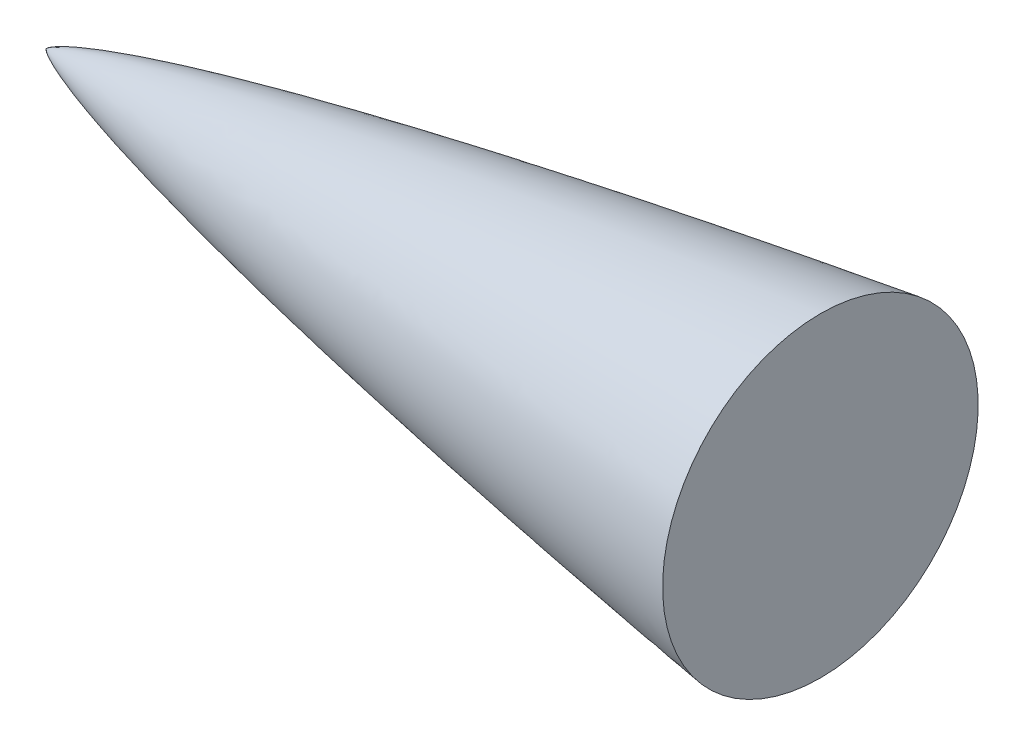
ISO-10303-21;
HEADER;
FILE_DESCRIPTION(('STEP AP214'),'2;1');
FILE_NAME('part.step','',(''),(''),'','','');
FILE_SCHEMA(('AUTOMOTIVE_DESIGN { 1 0 10303 214 1 1 1 1 }'));
ENDSEC;
DATA;
#1=APPLICATION_CONTEXT('core data for automotive mechanical design processes');
#2=APPLICATION_PROTOCOL_DEFINITION('international standard','automotive_design',2000,#1);
#3=PRODUCT_CONTEXT('',#1,'mechanical');
#4=PRODUCT('Part','Part','',(#3));
#5=PRODUCT_RELATED_PRODUCT_CATEGORY('part','',(#4));
#6=PRODUCT_DEFINITION_FORMATION('','',#4);
#7=PRODUCT_DEFINITION_CONTEXT('part definition',#1,'design');
#8=PRODUCT_DEFINITION('design','',#6,#7);
#9=PRODUCT_DEFINITION_SHAPE('','',#8);
#10=(LENGTH_UNIT() NAMED_UNIT(*) SI_UNIT(.MILLI.,.METRE.));
#11=(NAMED_UNIT(*) PLANE_ANGLE_UNIT() SI_UNIT($,.RADIAN.));
#12=(NAMED_UNIT(*) SI_UNIT($,.STERADIAN.) SOLID_ANGLE_UNIT());
#13=UNCERTAINTY_MEASURE_WITH_UNIT(LENGTH_MEASURE(1.E-05),#10,'distance_accuracy_value','');
#14=(GEOMETRIC_REPRESENTATION_CONTEXT(3) GLOBAL_UNCERTAINTY_ASSIGNED_CONTEXT((#13)) GLOBAL_UNIT_ASSIGNED_CONTEXT((#10,
#11,#12)) REPRESENTATION_CONTEXT('',''));
#15=CARTESIAN_POINT('',(0.,0.,0.));
#16=DIRECTION('',(0.,0.,1.));
#17=DIRECTION('',(1.,0.,0.));
#18=AXIS2_PLACEMENT_3D('',#15,#16,#17);
#19=CARTESIAN_POINT('',(762.,83.841254665666,0.));
#20=CARTESIAN_POINT('',(759.615436090338,83.8348786530274,0.));
#21=CARTESIAN_POINT('',(754.846503833814,83.7859260177921,0.));
#22=CARTESIAN_POINT('',(745.309411706468,83.6327608330306,0.));
#23=CARTESIAN_POINT('',(729.852911101212,83.2590075767634,0.));
#24=CARTESIAN_POINT('',(710.863439025648,82.6553562596267,0.));
#25=CARTESIAN_POINT('',(682.425589554388,81.5391979712966,0.));
#26=CARTESIAN_POINT('',(646.930327878799,79.8372948360595,0.));
#27=CARTESIAN_POINT('',(605.538293136767,77.4858004644496,0.));
#28=CARTESIAN_POINT('',(558.259527801623,74.3703783950666,0.));
#29=CARTESIAN_POINT('',(511.00790004468,70.8684145222591,0.));
#30=CARTESIAN_POINT('',(463.784734461524,67.0021255480557,0.));
#31=CARTESIAN_POINT('',(416.591925171861,62.781349506755,0.));
#32=CARTESIAN_POINT('',(369.432294543761,58.204857708494,0.));
#33=CARTESIAN_POINT('',(322.309575865078,53.2618983416283,0.));
#34=CARTESIAN_POINT('',(275.229416109303,47.9286839235141,0.));
#35=CARTESIAN_POINT('',(228.199436648054,42.167572329428,0.));
#36=CARTESIAN_POINT('',(181.232321927949,35.9138473948452,0.));
#37=CARTESIAN_POINT('',(134.347160824015,29.0668928368045,0.));
#38=CARTESIAN_POINT('',(92.5014071109869,22.2363785489674,0.));
#39=CARTESIAN_POINT('',(58.21468034422,15.8817272260005,0.));
#40=CARTESIAN_POINT('',(33.3857956173297,10.5208699171543,0.));
#41=CARTESIAN_POINT('',(18.9995170679273,6.91730383821913,0.));
#42=CARTESIAN_POINT('',(10.6680057521807,4.4902673249165,0.));
#43=CARTESIAN_POINT('',(6.15457812687039,2.96983830397565,0.));
#44=CARTESIAN_POINT('',(3.71093173791413,2.02979684979071,0.));
#45=CARTESIAN_POINT('',(2.33539055045532,1.4322686637271,0.));
#46=CARTESIAN_POINT('',(1.57274450360088,1.06289215559482,0.));
#47=CARTESIAN_POINT('',(1.12686422152927,0.826333920179848,0.));
#48=CARTESIAN_POINT('',(0.841412680935005,0.663024363572451,0.));
#49=CARTESIAN_POINT('',(0.646496772260084,0.544815951928162,0.));
#50=CARTESIAN_POINT('',(0.476816380111575,0.434147846193127,0.));
#51=CARTESIAN_POINT('',(0.332279693831272,0.331578395878514,0.));
#52=CARTESIAN_POINT('',(0.212062429273832,0.237272492825021,0.));
#53=CARTESIAN_POINT('',(0.127523873180296,0.16317614387605,0.));
#54=CARTESIAN_POINT('',(0.0656948489665144,0.100096678261966,0.));
#55=CARTESIAN_POINT('',(0.0254287850938619,0.0499114059335762,0.));
#56=CARTESIAN_POINT('',(0.00852037979638455,0.0225456416973723,0.));
#57=CARTESIAN_POINT('',(0.00246903573026898,0.00769815196811599,0.));
#58=CARTESIAN_POINT('',(0.,0.,0.));
#59=B_SPLINE_CURVE_WITH_KNOTS('',4,(#19,#20,#21,#22,#23,#24,#25,#26,#27,#28,#29,#30,#31,#32,#33,
#34,#35,#36,#37,#38,#39,#40,#41,#42,#43,#44,#45,#46,#47,#48,#49,#50,#51,#52,#53,#54,#55,#56,#57,
#58),.UNSPECIFIED.,.F.,.F.,(5,1,1,1,1,1,1,1,1,1,1,1,1,1,1,1,1,1,1,1,1,1,1,1,1,1,1,1,1,1,1,1,1,1,
1,1,5),(0.,0.0124161059668282,0.0248322119336565,0.049664423867313,0.0805025666095178,
0.111340709351723,0.173016994026944,0.234693278836645,0.296369564823901,0.358045848720771,
0.419722133463729,0.481398418876491,0.54307470462883,0.604750988677317,0.666427272970698,
0.728103557458164,0.789779842686226,0.851456126777999,0.913132399525486,0.948859992798878,
0.971324348437416,0.983696367274972,0.990338333588904,0.994032978251234,0.996115820711361,
0.997325305761031,0.998144918607654,0.998444153837526,0.998743389067397,0.99903753699717,
0.999331684926943,0.999498763695207,0.999665842463471,0.999832921231736,0.999916460615868,
0.999958230307934,1.),.UNSPECIFIED.);
#60=CARTESIAN_POINT('',(0.,0.,0.));
#61=DIRECTION('',(-1.,0.,0.));
#62=AXIS1_PLACEMENT('',#60,#61);
#63=SURFACE_OF_REVOLUTION('',#59,#62);
#64=CARTESIAN_POINT('',(0.,0.,0.));
#65=VERTEX_POINT('',#64);
#66=VERTEX_LOOP('',#65);
#67=FACE_BOUND('',#66,.T.);
#68=CARTESIAN_POINT('',(162.56,0.,0.));
#69=DIRECTION('',(-1.,0.,0.));
#70=DIRECTION('',(0.,-1.,0.));
#71=AXIS2_PLACEMENT_3D('',#68,#69,#70);
#72=CIRCLE('',#71,33.1280498009156);
#73=CARTESIAN_POINT('',(162.56,-33.1280498009156,0.));
#74=VERTEX_POINT('',#73);
#75=EDGE_CURVE('E11',#74,#74,#72,.F.);
#76=ORIENTED_EDGE('',*,*,#75,.F.);
#77=EDGE_LOOP('',(#76));
#78=FACE_BOUND('',#77,.T.);
#79=ADVANCED_FACE('F34',(#67,#78),#63,.T.);
#80=CARTESIAN_POINT('',(162.56,0.,0.));
#81=DIRECTION('',(1.,0.,0.));
#82=DIRECTION('',(0.,1.,0.));
#83=AXIS2_PLACEMENT_3D('',#80,#81,#82);
#84=PLANE('',#83);
#85=ORIENTED_EDGE('',*,*,#75,.T.);
#86=EDGE_LOOP('',(#85));
#87=FACE_BOUND('',#86,.T.);
#88=ADVANCED_FACE('F44',(#87),#84,.T.);
#89=CLOSED_SHELL('',(#79,#88));
#90=MANIFOLD_SOLID_BREP('B2',#89);
#91=ADVANCED_BREP_SHAPE_REPRESENTATION('',(#18,#90),#14);
#92=SHAPE_DEFINITION_REPRESENTATION(#9,#91);
ENDSEC;
END-ISO-10303-21;
